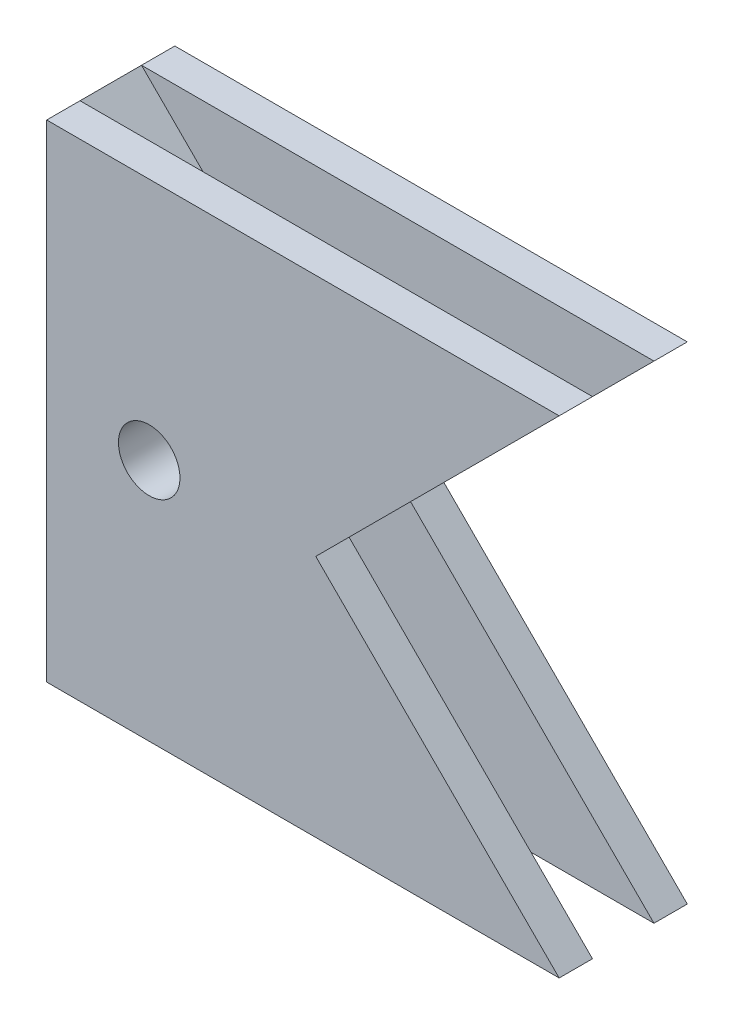
ISO-10303-21;
HEADER;
FILE_DESCRIPTION(('STEP AP214'),'2;1');
FILE_NAME('part.step','',(''),(''),'','','');
FILE_SCHEMA(('AUTOMOTIVE_DESIGN { 1 0 10303 214 1 1 1 1 }'));
ENDSEC;
DATA;
#1=APPLICATION_CONTEXT('core data for automotive mechanical design processes');
#2=APPLICATION_PROTOCOL_DEFINITION('international standard','automotive_design',2000,#1);
#3=PRODUCT_CONTEXT('',#1,'mechanical');
#4=PRODUCT('Part','Part','',(#3));
#5=PRODUCT_RELATED_PRODUCT_CATEGORY('part','',(#4));
#6=PRODUCT_DEFINITION_FORMATION('','',#4);
#7=PRODUCT_DEFINITION_CONTEXT('part definition',#1,'design');
#8=PRODUCT_DEFINITION('design','',#6,#7);
#9=PRODUCT_DEFINITION_SHAPE('','',#8);
#10=(LENGTH_UNIT() NAMED_UNIT(*) SI_UNIT(.MILLI.,.METRE.));
#11=(NAMED_UNIT(*) PLANE_ANGLE_UNIT() SI_UNIT($,.RADIAN.));
#12=(NAMED_UNIT(*) SI_UNIT($,.STERADIAN.) SOLID_ANGLE_UNIT());
#13=UNCERTAINTY_MEASURE_WITH_UNIT(LENGTH_MEASURE(1.E-05),#10,'distance_accuracy_value','');
#14=(GEOMETRIC_REPRESENTATION_CONTEXT(3) GLOBAL_UNCERTAINTY_ASSIGNED_CONTEXT((#13)) GLOBAL_UNIT_ASSIGNED_CONTEXT((#10,
#11,#12)) REPRESENTATION_CONTEXT('',''));
#15=CARTESIAN_POINT('',(0.,0.,0.));
#16=DIRECTION('',(0.,0.,1.));
#17=DIRECTION('',(1.,0.,0.));
#18=AXIS2_PLACEMENT_3D('',#15,#16,#17);
#19=CARTESIAN_POINT('',(0.,0.,-6.));
#20=DIRECTION('',(0.,1.,0.));
#21=DIRECTION('',(0.,0.,1.));
#22=AXIS2_PLACEMENT_3D('',#19,#20,#21);
#23=PLANE('',#22);
#24=DIRECTION('',(1.,0.,0.));
#25=VECTOR('',#24,1.);
#26=CARTESIAN_POINT('',(0.,0.,-12.5));
#27=LINE('',#26,#25);
#28=CARTESIAN_POINT('',(0.,0.,-12.5));
#29=VERTEX_POINT('',#28);
#30=CARTESIAN_POINT('',(100.,0.,-12.5));
#31=VERTEX_POINT('',#30);
#32=EDGE_CURVE('E192',#29,#31,#27,.T.);
#33=ORIENTED_EDGE('',*,*,#32,.T.);
#34=DIRECTION('',(0.,0.,-1.));
#35=VECTOR('',#34,1.);
#36=CARTESIAN_POINT('',(100.,0.,-6.));
#37=LINE('',#36,#35);
#38=CARTESIAN_POINT('',(100.,0.,-6.));
#39=VERTEX_POINT('',#38);
#40=EDGE_CURVE('E46',#39,#31,#37,.T.);
#41=ORIENTED_EDGE('',*,*,#40,.F.);
#42=DIRECTION('',(1.,0.,0.));
#43=VECTOR('',#42,1.);
#44=CARTESIAN_POINT('',(0.,0.,-6.));
#45=LINE('',#44,#43);
#46=CARTESIAN_POINT('',(0.,0.,-6.));
#47=VERTEX_POINT('',#46);
#48=EDGE_CURVE('E204',#47,#39,#45,.T.);
#49=ORIENTED_EDGE('',*,*,#48,.F.);
#50=DIRECTION('',(0.,0.,-1.));
#51=VECTOR('',#50,1.);
#52=CARTESIAN_POINT('',(0.,0.,-6.));
#53=LINE('',#52,#51);
#54=EDGE_CURVE('E11',#47,#29,#53,.T.);
#55=ORIENTED_EDGE('',*,*,#54,.T.);
#56=EDGE_LOOP('',(#33,#41,#49,#55));
#57=FACE_BOUND('',#56,.T.);
#58=ADVANCED_FACE('F39',(#57),#23,.F.);
#59=CARTESIAN_POINT('',(50.,50.,-6.));
#60=DIRECTION('',(0.707106781186547,0.707106781186548,0.));
#61=DIRECTION('',(-0.707106781186548,0.707106781186547,0.));
#62=AXIS2_PLACEMENT_3D('',#59,#60,#61);
#63=PLANE('',#62);
#64=DIRECTION('',(0.707106781186548,-0.707106781186547,0.));
#65=VECTOR('',#64,1.);
#66=CARTESIAN_POINT('',(50.,50.,-12.5));
#67=LINE('',#66,#65);
#68=CARTESIAN_POINT('',(52.5,47.5,-12.5));
#69=VERTEX_POINT('',#68);
#70=EDGE_CURVE('E217',#69,#31,#67,.T.);
#71=ORIENTED_EDGE('',*,*,#70,.F.);
#72=DIRECTION('',(0.,0.,-1.));
#73=VECTOR('',#72,1.);
#74=CARTESIAN_POINT('',(52.5,47.5,-6.));
#75=LINE('',#74,#73);
#76=CARTESIAN_POINT('',(52.5,47.5,-6.));
#77=VERTEX_POINT('',#76);
#78=EDGE_CURVE('E228',#77,#69,#75,.T.);
#79=ORIENTED_EDGE('',*,*,#78,.F.);
#80=DIRECTION('',(0.707106781186548,-0.707106781186547,0.));
#81=VECTOR('',#80,1.);
#82=CARTESIAN_POINT('',(50.,50.,-6.));
#83=LINE('',#82,#81);
#84=EDGE_CURVE('E206',#77,#39,#83,.T.);
#85=ORIENTED_EDGE('',*,*,#84,.T.);
#86=ORIENTED_EDGE('',*,*,#40,.T.);
#87=EDGE_LOOP('',(#71,#79,#85,#86));
#88=FACE_BOUND('',#87,.T.);
#89=ADVANCED_FACE('F232',(#88),#63,.T.);
#90=CARTESIAN_POINT('',(2.5,-2.5,-6.));
#91=DIRECTION('',(0.707106781186548,-0.707106781186548,0.));
#92=DIRECTION('',(0.707106781186548,0.707106781186548,0.));
#93=AXIS2_PLACEMENT_3D('',#90,#91,#92);
#94=PLANE('',#93);
#95=DIRECTION('',(-0.707106781186548,-0.707106781186548,0.));
#96=VECTOR('',#95,1.);
#97=CARTESIAN_POINT('',(2.5,-2.5,-12.5));
#98=LINE('',#97,#96);
#99=CARTESIAN_POINT('',(100.,95.,-12.5));
#100=VERTEX_POINT('',#99);
#101=EDGE_CURVE('E222',#100,#69,#98,.T.);
#102=ORIENTED_EDGE('',*,*,#101,.F.);
#103=DIRECTION('',(0.,0.,-1.));
#104=VECTOR('',#103,1.);
#105=CARTESIAN_POINT('',(100.,95.,-6.));
#106=LINE('',#105,#104);
#107=CARTESIAN_POINT('',(100.,95.,-6.));
#108=VERTEX_POINT('',#107);
#109=EDGE_CURVE('E226',#108,#100,#106,.T.);
#110=ORIENTED_EDGE('',*,*,#109,.F.);
#111=DIRECTION('',(-0.707106781186548,-0.707106781186548,0.));
#112=VECTOR('',#111,1.);
#113=CARTESIAN_POINT('',(2.5,-2.5,-6.));
#114=LINE('',#113,#112);
#115=EDGE_CURVE('E207',#108,#77,#114,.T.);
#116=ORIENTED_EDGE('',*,*,#115,.T.);
#117=ORIENTED_EDGE('',*,*,#78,.T.);
#118=EDGE_LOOP('',(#102,#110,#116,#117));
#119=FACE_BOUND('',#118,.T.);
#120=ADVANCED_FACE('F242',(#119),#94,.T.);
#121=CARTESIAN_POINT('',(0.,95.,-6.));
#122=DIRECTION('',(0.,1.,0.));
#123=DIRECTION('',(0.,0.,1.));
#124=AXIS2_PLACEMENT_3D('',#121,#122,#123);
#125=PLANE('',#124);
#126=DIRECTION('',(1.,0.,0.));
#127=VECTOR('',#126,1.);
#128=CARTESIAN_POINT('',(0.,95.,-12.5));
#129=LINE('',#128,#127);
#130=CARTESIAN_POINT('',(0.,95.,-12.5));
#131=VERTEX_POINT('',#130);
#132=EDGE_CURVE('E196',#131,#100,#129,.T.);
#133=ORIENTED_EDGE('',*,*,#132,.F.);
#134=DIRECTION('',(0.,0.,-1.));
#135=VECTOR('',#134,1.);
#136=CARTESIAN_POINT('',(0.,95.,-6.));
#137=LINE('',#136,#135);
#138=CARTESIAN_POINT('',(0.,95.,-6.));
#139=VERTEX_POINT('',#138);
#140=EDGE_CURVE('E214',#139,#131,#137,.T.);
#141=ORIENTED_EDGE('',*,*,#140,.F.);
#142=DIRECTION('',(1.,0.,0.));
#143=VECTOR('',#142,1.);
#144=CARTESIAN_POINT('',(0.,95.,-6.));
#145=LINE('',#144,#143);
#146=EDGE_CURVE('E215',#139,#108,#145,.T.);
#147=ORIENTED_EDGE('',*,*,#146,.T.);
#148=ORIENTED_EDGE('',*,*,#109,.T.);
#149=EDGE_LOOP('',(#133,#141,#147,#148));
#150=FACE_BOUND('',#149,.T.);
#151=ADVANCED_FACE('F257',(#150),#125,.T.);
#152=CARTESIAN_POINT('',(0.,0.,-6.));
#153=DIRECTION('',(0.,0.,1.));
#154=DIRECTION('',(1.,0.,0.));
#155=AXIS2_PLACEMENT_3D('',#152,#153,#154);
#156=PLANE('',#155);
#157=DIRECTION('',(0.707106781186548,-0.707106781186548,0.));
#158=VECTOR('',#157,1.);
#159=CARTESIAN_POINT('',(47.5,47.5,-6.));
#160=LINE('',#159,#158);
#161=CARTESIAN_POINT('',(43.9644660940672,51.0355339059328,-6.));
#162=VERTEX_POINT('',#161);
#163=EDGE_CURVE('E195',#139,#162,#160,.T.);
#164=ORIENTED_EDGE('',*,*,#163,.T.);
#165=CARTESIAN_POINT('',(40.4289321881345,47.5,-6.));
#166=DIRECTION('',(0.,0.,1.));
#167=DIRECTION('',(1.,0.,0.));
#168=AXIS2_PLACEMENT_3D('',#165,#166,#167);
#169=CIRCLE('',#168,5.);
#170=CARTESIAN_POINT('',(43.9644660940672,43.9644660940672,-6.));
#171=VERTEX_POINT('',#170);
#172=EDGE_CURVE('E197',#162,#171,#169,.F.);
#173=ORIENTED_EDGE('',*,*,#172,.T.);
#174=DIRECTION('',(-0.707106781186548,-0.707106781186547,0.));
#175=VECTOR('',#174,1.);
#176=CARTESIAN_POINT('',(0.,0.,-6.));
#177=LINE('',#176,#175);
#178=EDGE_CURVE('E203',#171,#47,#177,.T.);
#179=ORIENTED_EDGE('',*,*,#178,.T.);
#180=ORIENTED_EDGE('',*,*,#48,.T.);
#181=ORIENTED_EDGE('',*,*,#84,.F.);
#182=ORIENTED_EDGE('',*,*,#115,.F.);
#183=ORIENTED_EDGE('',*,*,#146,.F.);
#184=EDGE_LOOP('',(#164,#173,#179,#180,#181,#182,#183));
#185=FACE_BOUND('',#184,.T.);
#186=ADVANCED_FACE('F247',(#185),#156,.T.);
#187=CARTESIAN_POINT('',(0.,0.,-12.5));
#188=DIRECTION('',(0.,0.,1.));
#189=DIRECTION('',(1.,0.,0.));
#190=AXIS2_PLACEMENT_3D('',#187,#188,#189);
#191=PLANE('',#190);
#192=DIRECTION('',(0.,1.,0.));
#193=VECTOR('',#192,1.);
#194=CARTESIAN_POINT('',(0.,0.,-12.5));
#195=LINE('',#194,#193);
#196=EDGE_CURVE('E142',#29,#131,#195,.T.);
#197=ORIENTED_EDGE('',*,*,#196,.T.);
#198=ORIENTED_EDGE('',*,*,#132,.T.);
#199=ORIENTED_EDGE('',*,*,#101,.T.);
#200=ORIENTED_EDGE('',*,*,#70,.T.);
#201=ORIENTED_EDGE('',*,*,#32,.F.);
#202=EDGE_LOOP('',(#197,#198,#199,#200,#201));
#203=FACE_BOUND('',#202,.T.);
#204=CARTESIAN_POINT('',(20.,47.5,-12.5));
#205=DIRECTION('',(0.,0.,1.));
#206=DIRECTION('',(1.,0.,0.));
#207=AXIS2_PLACEMENT_3D('',#204,#205,#206);
#208=CIRCLE('',#207,6.);
#209=CARTESIAN_POINT('',(26.,47.5,-12.5));
#210=VERTEX_POINT('',#209);
#211=EDGE_CURVE('E178',#210,#210,#208,.T.);
#212=ORIENTED_EDGE('',*,*,#211,.T.);
#213=EDGE_LOOP('',(#212));
#214=FACE_BOUND('',#213,.T.);
#215=ADVANCED_FACE('F238',(#203,#214),#191,.F.);
#216=CARTESIAN_POINT('',(40.4289321881345,47.5,12.5));
#217=DIRECTION('',(0.,0.,-1.));
#218=DIRECTION('',(-1.,0.,0.));
#219=AXIS2_PLACEMENT_3D('',#216,#217,#218);
#220=CYLINDRICAL_SURFACE('',#219,5.);
#221=CARTESIAN_POINT('',(40.4289321881345,47.5,6.));
#222=DIRECTION('',(0.,0.,1.));
#223=DIRECTION('',(1.,0.,0.));
#224=AXIS2_PLACEMENT_3D('',#221,#222,#223);
#225=CIRCLE('',#224,5.);
#226=CARTESIAN_POINT('',(43.9644660940672,51.0355339059328,6.));
#227=VERTEX_POINT('',#226);
#228=CARTESIAN_POINT('',(43.9644660940672,43.9644660940672,6.));
#229=VERTEX_POINT('',#228);
#230=EDGE_CURVE('E158',#227,#229,#225,.F.);
#231=ORIENTED_EDGE('',*,*,#230,.T.);
#232=DIRECTION('',(0.,0.,-1.));
#233=VECTOR('',#232,1.);
#234=CARTESIAN_POINT('',(43.9644660940672,43.9644660940672,12.5));
#235=LINE('',#234,#233);
#236=EDGE_CURVE('E180',#229,#171,#235,.T.);
#237=ORIENTED_EDGE('',*,*,#236,.T.);
#238=ORIENTED_EDGE('',*,*,#172,.F.);
#239=DIRECTION('',(0.,0.,-1.));
#240=VECTOR('',#239,1.);
#241=CARTESIAN_POINT('',(43.9644660940672,51.0355339059328,12.5));
#242=LINE('',#241,#240);
#243=EDGE_CURVE('E193',#227,#162,#242,.T.);
#244=ORIENTED_EDGE('',*,*,#243,.F.);
#245=EDGE_LOOP('',(#231,#237,#238,#244));
#246=FACE_BOUND('',#245,.T.);
#247=ADVANCED_FACE('F263',(#246),#220,.T.);
#248=CARTESIAN_POINT('',(47.5,47.5,12.5));
#249=DIRECTION('',(0.707106781186548,0.707106781186548,0.));
#250=DIRECTION('',(-0.707106781186548,0.707106781186548,0.));
#251=AXIS2_PLACEMENT_3D('',#248,#249,#250);
#252=PLANE('',#251);
#253=DIRECTION('',(0.707106781186548,-0.707106781186548,0.));
#254=VECTOR('',#253,1.);
#255=CARTESIAN_POINT('',(47.5,47.5,6.));
#256=LINE('',#255,#254);
#257=CARTESIAN_POINT('',(0.,95.,6.));
#258=VERTEX_POINT('',#257);
#259=EDGE_CURVE('E52',#258,#227,#256,.T.);
#260=ORIENTED_EDGE('',*,*,#259,.T.);
#261=ORIENTED_EDGE('',*,*,#243,.T.);
#262=ORIENTED_EDGE('',*,*,#163,.F.);
#263=DIRECTION('',(0.,0.,-1.));
#264=VECTOR('',#263,1.);
#265=CARTESIAN_POINT('',(0.,95.,12.5));
#266=LINE('',#265,#264);
#267=EDGE_CURVE('E59',#258,#139,#266,.T.);
#268=ORIENTED_EDGE('',*,*,#267,.F.);
#269=EDGE_LOOP('',(#260,#261,#262,#268));
#270=FACE_BOUND('',#269,.T.);
#271=ADVANCED_FACE('F261',(#270),#252,.T.);
#272=CARTESIAN_POINT('',(0.,0.,12.5));
#273=DIRECTION('',(-1.,0.,0.));
#274=DIRECTION('',(0.,0.,1.));
#275=AXIS2_PLACEMENT_3D('',#272,#273,#274);
#276=PLANE('',#275);
#277=ORIENTED_EDGE('',*,*,#196,.F.);
#278=ORIENTED_EDGE('',*,*,#54,.F.);
#279=DIRECTION('',(0.,0.,-1.));
#280=VECTOR('',#279,1.);
#281=CARTESIAN_POINT('',(0.,0.,12.5));
#282=LINE('',#281,#280);
#283=CARTESIAN_POINT('',(0.,0.,6.));
#284=VERTEX_POINT('',#283);
#285=EDGE_CURVE('E183',#284,#47,#282,.T.);
#286=ORIENTED_EDGE('',*,*,#285,.F.);
#287=CARTESIAN_POINT('',(0.,0.,12.5));
#288=VERTEX_POINT('',#287);
#289=EDGE_CURVE('E189',#288,#284,#282,.T.);
#290=ORIENTED_EDGE('',*,*,#289,.F.);
#291=DIRECTION('',(0.,1.,0.));
#292=VECTOR('',#291,1.);
#293=CARTESIAN_POINT('',(0.,0.,12.5));
#294=LINE('',#293,#292);
#295=CARTESIAN_POINT('',(0.,95.,12.5));
#296=VERTEX_POINT('',#295);
#297=EDGE_CURVE('E175',#288,#296,#294,.T.);
#298=ORIENTED_EDGE('',*,*,#297,.T.);
#299=EDGE_CURVE('E188',#296,#258,#266,.T.);
#300=ORIENTED_EDGE('',*,*,#299,.T.);
#301=ORIENTED_EDGE('',*,*,#267,.T.);
#302=ORIENTED_EDGE('',*,*,#140,.T.);
#303=EDGE_LOOP('',(#277,#278,#286,#290,#298,#300,#301,#302));
#304=FACE_BOUND('',#303,.T.);
#305=ADVANCED_FACE('F260',(#304),#276,.T.);
#306=CARTESIAN_POINT('',(0.,0.,12.5));
#307=DIRECTION('',(0.707106781186547,-0.707106781186548,0.));
#308=DIRECTION('',(0.707106781186548,0.707106781186547,0.));
#309=AXIS2_PLACEMENT_3D('',#306,#307,#308);
#310=PLANE('',#309);
#311=DIRECTION('',(-0.707106781186548,-0.707106781186547,0.));
#312=VECTOR('',#311,1.);
#313=CARTESIAN_POINT('',(0.,0.,6.));
#314=LINE('',#313,#312);
#315=EDGE_CURVE('E156',#229,#284,#314,.T.);
#316=ORIENTED_EDGE('',*,*,#315,.T.);
#317=ORIENTED_EDGE('',*,*,#285,.T.);
#318=ORIENTED_EDGE('',*,*,#178,.F.);
#319=ORIENTED_EDGE('',*,*,#236,.F.);
#320=EDGE_LOOP('',(#316,#317,#318,#319));
#321=FACE_BOUND('',#320,.T.);
#322=ADVANCED_FACE('F251',(#321),#310,.T.);
#323=CARTESIAN_POINT('',(20.,47.5,12.5));
#324=DIRECTION('',(0.,0.,-1.));
#325=DIRECTION('',(-1.,0.,0.));
#326=AXIS2_PLACEMENT_3D('',#323,#324,#325);
#327=CYLINDRICAL_SURFACE('',#326,6.);
#328=CARTESIAN_POINT('',(20.,47.5,12.5));
#329=DIRECTION('',(0.,0.,1.));
#330=DIRECTION('',(1.,0.,0.));
#331=AXIS2_PLACEMENT_3D('',#328,#329,#330);
#332=CIRCLE('',#331,6.);
#333=CARTESIAN_POINT('',(26.,47.5,12.5));
#334=VERTEX_POINT('',#333);
#335=EDGE_CURVE('E172',#334,#334,#332,.T.);
#336=ORIENTED_EDGE('',*,*,#335,.T.);
#337=EDGE_LOOP('',(#336));
#338=FACE_BOUND('',#337,.T.);
#339=ORIENTED_EDGE('',*,*,#211,.F.);
#340=EDGE_LOOP('',(#339));
#341=FACE_BOUND('',#340,.T.);
#342=ADVANCED_FACE('F307',(#338,#341),#327,.F.);
#343=CARTESIAN_POINT('',(0.,0.,12.5));
#344=DIRECTION('',(0.,0.,1.));
#345=DIRECTION('',(1.,0.,0.));
#346=AXIS2_PLACEMENT_3D('',#343,#344,#345);
#347=PLANE('',#346);
#348=DIRECTION('',(1.,0.,0.));
#349=VECTOR('',#348,1.);
#350=CARTESIAN_POINT('',(0.,95.,12.5));
#351=LINE('',#350,#349);
#352=CARTESIAN_POINT('',(100.,95.,12.5));
#353=VERTEX_POINT('',#352);
#354=EDGE_CURVE('E140',#296,#353,#351,.T.);
#355=ORIENTED_EDGE('',*,*,#354,.F.);
#356=ORIENTED_EDGE('',*,*,#297,.F.);
#357=DIRECTION('',(1.,0.,0.));
#358=VECTOR('',#357,1.);
#359=CARTESIAN_POINT('',(0.,0.,12.5));
#360=LINE('',#359,#358);
#361=CARTESIAN_POINT('',(100.,0.,12.5));
#362=VERTEX_POINT('',#361);
#363=EDGE_CURVE('E169',#288,#362,#360,.T.);
#364=ORIENTED_EDGE('',*,*,#363,.T.);
#365=DIRECTION('',(0.707106781186548,-0.707106781186547,0.));
#366=VECTOR('',#365,1.);
#367=CARTESIAN_POINT('',(50.,50.,12.5));
#368=LINE('',#367,#366);
#369=CARTESIAN_POINT('',(52.5,47.5,12.5));
#370=VERTEX_POINT('',#369);
#371=EDGE_CURVE('E164',#370,#362,#368,.T.);
#372=ORIENTED_EDGE('',*,*,#371,.F.);
#373=DIRECTION('',(-0.707106781186548,-0.707106781186548,0.));
#374=VECTOR('',#373,1.);
#375=CARTESIAN_POINT('',(2.5,-2.5,12.5));
#376=LINE('',#375,#374);
#377=EDGE_CURVE('E162',#353,#370,#376,.T.);
#378=ORIENTED_EDGE('',*,*,#377,.F.);
#379=EDGE_LOOP('',(#355,#356,#364,#372,#378));
#380=FACE_BOUND('',#379,.T.);
#381=ORIENTED_EDGE('',*,*,#335,.F.);
#382=EDGE_LOOP('',(#381));
#383=FACE_BOUND('',#382,.T.);
#384=ADVANCED_FACE('F271',(#380,#383),#347,.T.);
#385=CARTESIAN_POINT('',(0.,95.,6.));
#386=DIRECTION('',(0.,-1.,0.));
#387=DIRECTION('',(0.,0.,-1.));
#388=AXIS2_PLACEMENT_3D('',#385,#386,#387);
#389=PLANE('',#388);
#390=ORIENTED_EDGE('',*,*,#354,.T.);
#391=DIRECTION('',(0.,0.,1.));
#392=VECTOR('',#391,1.);
#393=CARTESIAN_POINT('',(100.,95.,6.));
#394=LINE('',#393,#392);
#395=CARTESIAN_POINT('',(100.,95.,6.));
#396=VERTEX_POINT('',#395);
#397=EDGE_CURVE('E138',#396,#353,#394,.T.);
#398=ORIENTED_EDGE('',*,*,#397,.F.);
#399=DIRECTION('',(1.,0.,0.));
#400=VECTOR('',#399,1.);
#401=CARTESIAN_POINT('',(0.,95.,6.));
#402=LINE('',#401,#400);
#403=EDGE_CURVE('E121',#258,#396,#402,.T.);
#404=ORIENTED_EDGE('',*,*,#403,.F.);
#405=ORIENTED_EDGE('',*,*,#299,.F.);
#406=EDGE_LOOP('',(#390,#398,#404,#405));
#407=FACE_BOUND('',#406,.T.);
#408=ADVANCED_FACE('F139',(#407),#389,.F.);
#409=CARTESIAN_POINT('',(2.5,-2.5,6.));
#410=DIRECTION('',(-0.707106781186548,0.707106781186548,0.));
#411=DIRECTION('',(-0.707106781186548,-0.707106781186548,0.));
#412=AXIS2_PLACEMENT_3D('',#409,#410,#411);
#413=PLANE('',#412);
#414=ORIENTED_EDGE('',*,*,#377,.T.);
#415=DIRECTION('',(0.,0.,1.));
#416=VECTOR('',#415,1.);
#417=CARTESIAN_POINT('',(52.5,47.5,6.));
#418=LINE('',#417,#416);
#419=CARTESIAN_POINT('',(52.5,47.5,6.));
#420=VERTEX_POINT('',#419);
#421=EDGE_CURVE('E141',#420,#370,#418,.T.);
#422=ORIENTED_EDGE('',*,*,#421,.F.);
#423=DIRECTION('',(-0.707106781186548,-0.707106781186548,0.));
#424=VECTOR('',#423,1.);
#425=CARTESIAN_POINT('',(2.5,-2.5,6.));
#426=LINE('',#425,#424);
#427=EDGE_CURVE('E129',#396,#420,#426,.T.);
#428=ORIENTED_EDGE('',*,*,#427,.F.);
#429=ORIENTED_EDGE('',*,*,#397,.T.);
#430=EDGE_LOOP('',(#414,#422,#428,#429));
#431=FACE_BOUND('',#430,.T.);
#432=ADVANCED_FACE('F144',(#431),#413,.F.);
#433=CARTESIAN_POINT('',(50.,50.,6.));
#434=DIRECTION('',(-0.707106781186547,-0.707106781186548,0.));
#435=DIRECTION('',(0.707106781186548,-0.707106781186547,0.));
#436=AXIS2_PLACEMENT_3D('',#433,#434,#435);
#437=PLANE('',#436);
#438=ORIENTED_EDGE('',*,*,#371,.T.);
#439=DIRECTION('',(0.,0.,1.));
#440=VECTOR('',#439,1.);
#441=CARTESIAN_POINT('',(100.,0.,6.));
#442=LINE('',#441,#440);
#443=CARTESIAN_POINT('',(100.,0.,6.));
#444=VERTEX_POINT('',#443);
#445=EDGE_CURVE('E161',#444,#362,#442,.T.);
#446=ORIENTED_EDGE('',*,*,#445,.F.);
#447=DIRECTION('',(0.707106781186548,-0.707106781186547,0.));
#448=VECTOR('',#447,1.);
#449=CARTESIAN_POINT('',(50.,50.,6.));
#450=LINE('',#449,#448);
#451=EDGE_CURVE('E146',#420,#444,#450,.T.);
#452=ORIENTED_EDGE('',*,*,#451,.F.);
#453=ORIENTED_EDGE('',*,*,#421,.T.);
#454=EDGE_LOOP('',(#438,#446,#452,#453));
#455=FACE_BOUND('',#454,.T.);
#456=ADVANCED_FACE('F274',(#455),#437,.F.);
#457=CARTESIAN_POINT('',(0.,0.,6.));
#458=DIRECTION('',(0.,-1.,0.));
#459=DIRECTION('',(0.,0.,-1.));
#460=AXIS2_PLACEMENT_3D('',#457,#458,#459);
#461=PLANE('',#460);
#462=ORIENTED_EDGE('',*,*,#363,.F.);
#463=ORIENTED_EDGE('',*,*,#289,.T.);
#464=DIRECTION('',(1.,0.,0.));
#465=VECTOR('',#464,1.);
#466=CARTESIAN_POINT('',(0.,0.,6.));
#467=LINE('',#466,#465);
#468=EDGE_CURVE('E147',#284,#444,#467,.T.);
#469=ORIENTED_EDGE('',*,*,#468,.T.);
#470=ORIENTED_EDGE('',*,*,#445,.T.);
#471=EDGE_LOOP('',(#462,#463,#469,#470));
#472=FACE_BOUND('',#471,.T.);
#473=ADVANCED_FACE('F268',(#472),#461,.T.);
#474=CARTESIAN_POINT('',(0.,0.,6.));
#475=DIRECTION('',(0.,0.,-1.));
#476=DIRECTION('',(1.,0.,0.));
#477=AXIS2_PLACEMENT_3D('',#474,#475,#476);
#478=PLANE('',#477);
#479=ORIENTED_EDGE('',*,*,#259,.F.);
#480=ORIENTED_EDGE('',*,*,#403,.T.);
#481=ORIENTED_EDGE('',*,*,#427,.T.);
#482=ORIENTED_EDGE('',*,*,#451,.T.);
#483=ORIENTED_EDGE('',*,*,#468,.F.);
#484=ORIENTED_EDGE('',*,*,#315,.F.);
#485=ORIENTED_EDGE('',*,*,#230,.F.);
#486=EDGE_LOOP('',(#479,#480,#481,#482,#483,#484,#485));
#487=FACE_BOUND('',#486,.T.);
#488=ADVANCED_FACE('F130',(#487),#478,.T.);
#489=CLOSED_SHELL('',(#58,#89,#120,#151,#186,#215,#247,#271,#305,#322,#342,#384,#408,#432,#456,
#473,#488));
#490=MANIFOLD_SOLID_BREP('B2',#489);
#491=ADVANCED_BREP_SHAPE_REPRESENTATION('',(#18,#490),#14);
#492=SHAPE_DEFINITION_REPRESENTATION(#9,#491);
ENDSEC;
END-ISO-10303-21;
